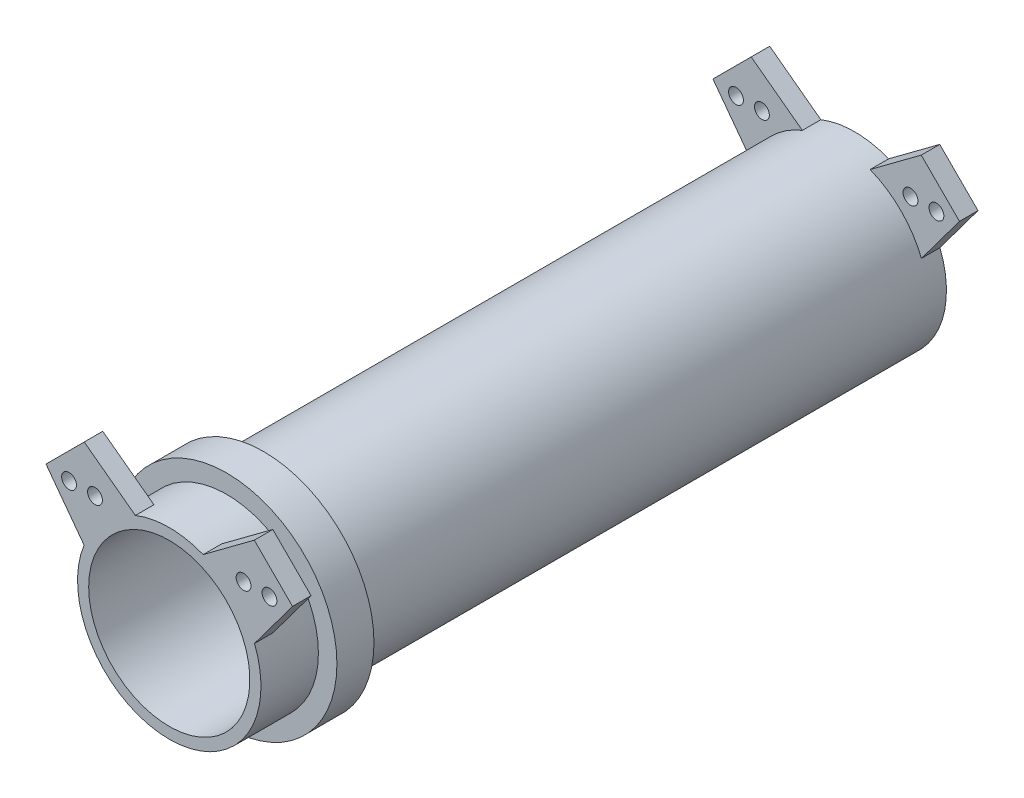
ISO-10303-21;
HEADER;
FILE_DESCRIPTION(('STEP AP214'),'2;1');
FILE_NAME('part.step','',(''),(''),'','','');
FILE_SCHEMA(('AUTOMOTIVE_DESIGN { 1 0 10303 214 1 1 1 1 }'));
ENDSEC;
DATA;
#1=APPLICATION_CONTEXT('core data for automotive mechanical design processes');
#2=APPLICATION_PROTOCOL_DEFINITION('international standard','automotive_design',2000,#1);
#3=PRODUCT_CONTEXT('',#1,'mechanical');
#4=PRODUCT('Part','Part','',(#3));
#5=PRODUCT_RELATED_PRODUCT_CATEGORY('part','',(#4));
#6=PRODUCT_DEFINITION_FORMATION('','',#4);
#7=PRODUCT_DEFINITION_CONTEXT('part definition',#1,'design');
#8=PRODUCT_DEFINITION('design','',#6,#7);
#9=PRODUCT_DEFINITION_SHAPE('','',#8);
#10=(LENGTH_UNIT() NAMED_UNIT(*) SI_UNIT(.MILLI.,.METRE.));
#11=(NAMED_UNIT(*) PLANE_ANGLE_UNIT() SI_UNIT($,.RADIAN.));
#12=(NAMED_UNIT(*) SI_UNIT($,.STERADIAN.) SOLID_ANGLE_UNIT());
#13=UNCERTAINTY_MEASURE_WITH_UNIT(LENGTH_MEASURE(1.E-05),#10,'distance_accuracy_value','');
#14=(GEOMETRIC_REPRESENTATION_CONTEXT(3) GLOBAL_UNCERTAINTY_ASSIGNED_CONTEXT((#13)) GLOBAL_UNIT_ASSIGNED_CONTEXT((#10,
#11,#12)) REPRESENTATION_CONTEXT('',''));
#15=CARTESIAN_POINT('',(0.,0.,0.));
#16=DIRECTION('',(0.,0.,1.));
#17=DIRECTION('',(1.,0.,0.));
#18=AXIS2_PLACEMENT_3D('',#15,#16,#17);
#19=CARTESIAN_POINT('',(0.,0.,90.));
#20=DIRECTION('',(0.,0.,-1.));
#21=DIRECTION('',(-1.,0.,0.));
#22=AXIS2_PLACEMENT_3D('',#19,#20,#21);
#23=CYLINDRICAL_SURFACE('',#22,24.75);
#24=CARTESIAN_POINT('',(0.,0.,67.));
#25=DIRECTION('',(0.,0.,-1.));
#26=DIRECTION('',(-1.,0.,0.));
#27=AXIS2_PLACEMENT_3D('',#24,#25,#26);
#28=CIRCLE('',#27,24.75);
#29=CARTESIAN_POINT('',(-24.75,0.,67.));
#30=VERTEX_POINT('',#29);
#31=EDGE_CURVE('E252',#30,#30,#28,.T.);
#32=ORIENTED_EDGE('',*,*,#31,.T.);
#33=EDGE_LOOP('',(#32));
#34=FACE_BOUND('',#33,.T.);
#35=DIRECTION('',(0.,0.,-1.));
#36=VECTOR('',#35,1.);
#37=CARTESIAN_POINT('',(9.14712231360463,22.9976662594263,-87.5));
#38=LINE('',#37,#36);
#39=CARTESIAN_POINT('',(9.14712231360462,22.9976662594263,-87.5));
#40=VERTEX_POINT('',#39);
#41=CARTESIAN_POINT('',(9.14712231360463,22.9976662594263,-92.5));
#42=VERTEX_POINT('',#41);
#43=EDGE_CURVE('E177',#40,#42,#38,.T.);
#44=ORIENTED_EDGE('',*,*,#43,.T.);
#45=CARTESIAN_POINT('',(0.,0.,-92.5));
#46=DIRECTION('',(0.,0.,1.));
#47=DIRECTION('',(1.,0.,0.));
#48=AXIS2_PLACEMENT_3D('',#45,#46,#47);
#49=CIRCLE('',#48,24.75);
#50=CARTESIAN_POINT('',(-9.14712231360463,22.9976662594263,-92.5));
#51=VERTEX_POINT('',#50);
#52=EDGE_CURVE('E246',#42,#51,#49,.T.);
#53=ORIENTED_EDGE('',*,*,#52,.T.);
#54=DIRECTION('',(0.,0.,-1.));
#55=VECTOR('',#54,1.);
#56=CARTESIAN_POINT('',(-9.14712231360463,22.9976662594263,-87.5));
#57=LINE('',#56,#55);
#58=CARTESIAN_POINT('',(-9.14712231360462,22.9976662594263,-87.5));
#59=VERTEX_POINT('',#58);
#60=EDGE_CURVE('E220',#59,#51,#57,.T.);
#61=ORIENTED_EDGE('',*,*,#60,.F.);
#62=CARTESIAN_POINT('',(0.,0.,-87.5));
#63=DIRECTION('',(0.,0.,1.));
#64=DIRECTION('',(1.,0.,0.));
#65=AXIS2_PLACEMENT_3D('',#62,#63,#64);
#66=CIRCLE('',#65,24.75);
#67=CARTESIAN_POINT('',(-22.9976662594264,9.14712231360437,-87.5));
#68=VERTEX_POINT('',#67);
#69=EDGE_CURVE('E212',#59,#68,#66,.T.);
#70=ORIENTED_EDGE('',*,*,#69,.T.);
#71=DIRECTION('',(0.,0.,-1.));
#72=VECTOR('',#71,1.);
#73=CARTESIAN_POINT('',(-22.9976662594264,9.14712231360438,-87.5));
#74=LINE('',#73,#72);
#75=CARTESIAN_POINT('',(-22.9976662594264,9.14712231360438,-92.5));
#76=VERTEX_POINT('',#75);
#77=EDGE_CURVE('E239',#68,#76,#74,.T.);
#78=ORIENTED_EDGE('',*,*,#77,.T.);
#79=CARTESIAN_POINT('',(22.9976662594264,9.14712231360438,-92.5));
#80=VERTEX_POINT('',#79);
#81=EDGE_CURVE('E247',#76,#80,#49,.T.);
#82=ORIENTED_EDGE('',*,*,#81,.T.);
#83=DIRECTION('',(0.,0.,-1.));
#84=VECTOR('',#83,1.);
#85=CARTESIAN_POINT('',(22.9976662594264,9.14712231360438,-87.5));
#86=LINE('',#85,#84);
#87=CARTESIAN_POINT('',(22.9976662594264,9.14712231360438,-87.5));
#88=VERTEX_POINT('',#87);
#89=EDGE_CURVE('E58',#88,#80,#86,.T.);
#90=ORIENTED_EDGE('',*,*,#89,.F.);
#91=CARTESIAN_POINT('',(0.,0.,-87.5));
#92=DIRECTION('',(0.,0.,-1.));
#93=DIRECTION('',(-1.,0.,0.));
#94=AXIS2_PLACEMENT_3D('',#91,#92,#93);
#95=CIRCLE('',#94,24.75);
#96=EDGE_CURVE('E62',#40,#88,#95,.T.);
#97=ORIENTED_EDGE('',*,*,#96,.F.);
#98=EDGE_LOOP('',(#44,#53,#61,#70,#78,#82,#90,#97));
#99=FACE_BOUND('',#98,.T.);
#100=ADVANCED_FACE('F43',(#34,#99),#23,.T.);
#101=CARTESIAN_POINT('',(0.,0.,92.5));
#102=DIRECTION('',(0.,0.,1.));
#103=DIRECTION('',(1.,0.,0.));
#104=AXIS2_PLACEMENT_3D('',#101,#102,#103);
#105=CIRCLE('',#104,24.75);
#106=CARTESIAN_POINT('',(9.14712231360463,22.9976662594263,92.5));
#107=VERTEX_POINT('',#106);
#108=CARTESIAN_POINT('',(-9.14712231360463,22.9976662594263,92.5));
#109=VERTEX_POINT('',#108);
#110=EDGE_CURVE('E339',#107,#109,#105,.T.);
#111=ORIENTED_EDGE('',*,*,#110,.F.);
#112=DIRECTION('',(0.,0.,1.));
#113=VECTOR('',#112,1.);
#114=CARTESIAN_POINT('',(9.14712231360463,22.9976662594263,87.5));
#115=LINE('',#114,#113);
#116=CARTESIAN_POINT('',(9.14712231360463,22.9976662594263,87.5));
#117=VERTEX_POINT('',#116);
#118=EDGE_CURVE('E275',#117,#107,#115,.T.);
#119=ORIENTED_EDGE('',*,*,#118,.F.);
#120=CARTESIAN_POINT('',(0.,0.,87.5));
#121=DIRECTION('',(0.,0.,-1.));
#122=DIRECTION('',(-1.,0.,0.));
#123=AXIS2_PLACEMENT_3D('',#120,#121,#122);
#124=CIRCLE('',#123,24.75);
#125=CARTESIAN_POINT('',(22.9976662594264,9.14712231360438,87.5));
#126=VERTEX_POINT('',#125);
#127=EDGE_CURVE('E266',#117,#126,#124,.T.);
#128=ORIENTED_EDGE('',*,*,#127,.T.);
#129=DIRECTION('',(0.,0.,1.));
#130=VECTOR('',#129,1.);
#131=CARTESIAN_POINT('',(22.9976662594264,9.14712231360438,87.5));
#132=LINE('',#131,#130);
#133=CARTESIAN_POINT('',(22.9976662594264,9.14712231360438,92.5));
#134=VERTEX_POINT('',#133);
#135=EDGE_CURVE('E293',#126,#134,#132,.T.);
#136=ORIENTED_EDGE('',*,*,#135,.T.);
#137=CARTESIAN_POINT('',(-22.9976662594264,9.14712231360438,92.5));
#138=VERTEX_POINT('',#137);
#139=EDGE_CURVE('E340',#138,#134,#105,.T.);
#140=ORIENTED_EDGE('',*,*,#139,.F.);
#141=DIRECTION('',(0.,0.,1.));
#142=VECTOR('',#141,1.);
#143=CARTESIAN_POINT('',(-22.9976662594264,9.14712231360438,87.5));
#144=LINE('',#143,#142);
#145=CARTESIAN_POINT('',(-22.9976662594264,9.14712231360438,87.5));
#146=VERTEX_POINT('',#145);
#147=EDGE_CURVE('E329',#146,#138,#144,.T.);
#148=ORIENTED_EDGE('',*,*,#147,.F.);
#149=CARTESIAN_POINT('',(0.,0.,87.5));
#150=DIRECTION('',(0.,0.,1.));
#151=DIRECTION('',(1.,0.,0.));
#152=AXIS2_PLACEMENT_3D('',#149,#150,#151);
#153=CIRCLE('',#152,24.75);
#154=CARTESIAN_POINT('',(-9.14712231360463,22.9976662594263,87.5));
#155=VERTEX_POINT('',#154);
#156=EDGE_CURVE('E311',#155,#146,#153,.T.);
#157=ORIENTED_EDGE('',*,*,#156,.F.);
#158=DIRECTION('',(0.,0.,1.));
#159=VECTOR('',#158,1.);
#160=CARTESIAN_POINT('',(-9.14712231360463,22.9976662594263,87.5));
#161=LINE('',#160,#159);
#162=EDGE_CURVE('E325',#155,#109,#161,.T.);
#163=ORIENTED_EDGE('',*,*,#162,.T.);
#164=EDGE_LOOP('',(#111,#119,#128,#136,#140,#148,#157,#163));
#165=FACE_BOUND('',#164,.T.);
#166=CARTESIAN_POINT('',(0.,0.,77.));
#167=DIRECTION('',(0.,0.,1.));
#168=DIRECTION('',(1.,0.,0.));
#169=AXIS2_PLACEMENT_3D('',#166,#167,#168);
#170=CIRCLE('',#169,24.75);
#171=CARTESIAN_POINT('',(24.75,0.,77.));
#172=VERTEX_POINT('',#171);
#173=EDGE_CURVE('E11',#172,#172,#170,.T.);
#174=ORIENTED_EDGE('',*,*,#173,.T.);
#175=EDGE_LOOP('',(#174));
#176=FACE_BOUND('',#175,.T.);
#177=ADVANCED_FACE('F45',(#165,#176),#23,.T.);
#178=CARTESIAN_POINT('',(0.,0.,90.));
#179=DIRECTION('',(0.,0.,-1.));
#180=DIRECTION('',(-1.,0.,0.));
#181=AXIS2_PLACEMENT_3D('',#178,#179,#180);
#182=CYLINDRICAL_SURFACE('',#181,21.75);
#183=CARTESIAN_POINT('',(0.,0.,-92.5));
#184=DIRECTION('',(0.,0.,1.));
#185=DIRECTION('',(1.,0.,0.));
#186=AXIS2_PLACEMENT_3D('',#183,#184,#185);
#187=CIRCLE('',#186,21.75);
#188=CARTESIAN_POINT('',(-21.75,0.,-92.5));
#189=VERTEX_POINT('',#188);
#190=EDGE_CURVE('E236',#189,#189,#187,.T.);
#191=CARTESIAN_POINT('',(0.,0.,92.5));
#192=DIRECTION('',(0.,0.,1.));
#193=DIRECTION('',(1.,0.,0.));
#194=AXIS2_PLACEMENT_3D('',#191,#192,#193);
#195=CIRCLE('',#194,21.75);
#196=CARTESIAN_POINT('',(-21.75,0.,92.5));
#197=VERTEX_POINT('',#196);
#198=EDGE_CURVE('E328',#197,#197,#195,.T.);
#199=CARTESIAN_POINT('',(-21.75,0.,-92.5));
#200=CARTESIAN_POINT('',(-21.75,0.,-90.5729166666667));
#201=CARTESIAN_POINT('',(-21.75,0.,-88.6458333333334));
#202=CARTESIAN_POINT('',(-21.75,0.,-84.7916666666667));
#203=CARTESIAN_POINT('',(-21.75,0.,-82.8645833333334));
#204=CARTESIAN_POINT('',(-21.75,0.,-79.0104166666667));
#205=CARTESIAN_POINT('',(-21.75,0.,-77.0833333333334));
#206=CARTESIAN_POINT('',(-21.75,0.,-73.2291666666667));
#207=CARTESIAN_POINT('',(-21.75,0.,-71.3020833333334));
#208=CARTESIAN_POINT('',(-21.75,0.,-67.4479166666667));
#209=CARTESIAN_POINT('',(-21.75,0.,-65.5208333333333));
#210=CARTESIAN_POINT('',(-21.75,0.,-61.6666666666667));
#211=CARTESIAN_POINT('',(-21.75,0.,-59.7395833333333));
#212=CARTESIAN_POINT('',(-21.75,0.,-55.8854166666667));
#213=CARTESIAN_POINT('',(-21.75,0.,-53.9583333333334));
#214=CARTESIAN_POINT('',(-21.75,0.,-50.1041666666667));
#215=CARTESIAN_POINT('',(-21.75,0.,-48.1770833333333));
#216=CARTESIAN_POINT('',(-21.75,0.,-44.3229166666667));
#217=CARTESIAN_POINT('',(-21.75,0.,-42.3958333333333));
#218=CARTESIAN_POINT('',(-21.75,0.,-38.5416666666667));
#219=CARTESIAN_POINT('',(-21.75,0.,-36.6145833333333));
#220=CARTESIAN_POINT('',(-21.75,0.,-32.7604166666667));
#221=CARTESIAN_POINT('',(-21.75,0.,-30.8333333333334));
#222=CARTESIAN_POINT('',(-21.75,0.,-26.9791666666667));
#223=CARTESIAN_POINT('',(-21.75,0.,-25.0520833333334));
#224=CARTESIAN_POINT('',(-21.75,0.,-21.1979166666667));
#225=CARTESIAN_POINT('',(-21.75,0.,-19.2708333333333));
#226=CARTESIAN_POINT('',(-21.75,0.,-15.4166666666667));
#227=CARTESIAN_POINT('',(-21.75,0.,-13.4895833333334));
#228=CARTESIAN_POINT('',(-21.75,0.,-9.63541666666668));
#229=CARTESIAN_POINT('',(-21.75,0.,-7.70833333333335));
#230=CARTESIAN_POINT('',(-21.75,0.,-3.85416666666668));
#231=CARTESIAN_POINT('',(-21.75,0.,-1.92708333333335));
#232=CARTESIAN_POINT('',(-21.75,0.,1.92708333333332));
#233=CARTESIAN_POINT('',(-21.75,0.,3.85416666666665));
#234=CARTESIAN_POINT('',(-21.75,0.,7.70833333333332));
#235=CARTESIAN_POINT('',(-21.75,0.,9.63541666666666));
#236=CARTESIAN_POINT('',(-21.75,0.,13.4895833333333));
#237=CARTESIAN_POINT('',(-21.75,0.,15.4166666666667));
#238=CARTESIAN_POINT('',(-21.75,0.,19.2708333333333));
#239=CARTESIAN_POINT('',(-21.75,0.,21.1979166666667));
#240=CARTESIAN_POINT('',(-21.75,0.,25.0520833333333));
#241=CARTESIAN_POINT('',(-21.75,0.,26.9791666666667));
#242=CARTESIAN_POINT('',(-21.75,0.,30.8333333333333));
#243=CARTESIAN_POINT('',(-21.75,0.,32.7604166666667));
#244=CARTESIAN_POINT('',(-21.75,0.,36.6145833333333));
#245=CARTESIAN_POINT('',(-21.75,0.,38.5416666666667));
#246=CARTESIAN_POINT('',(-21.75,0.,42.3958333333333));
#247=CARTESIAN_POINT('',(-21.75,0.,44.3229166666667));
#248=CARTESIAN_POINT('',(-21.75,0.,48.1770833333333));
#249=CARTESIAN_POINT('',(-21.75,0.,50.1041666666667));
#250=CARTESIAN_POINT('',(-21.75,0.,53.9583333333333));
#251=CARTESIAN_POINT('',(-21.75,0.,55.8854166666667));
#252=CARTESIAN_POINT('',(-21.75,0.,59.7395833333333));
#253=CARTESIAN_POINT('',(-21.75,0.,61.6666666666667));
#254=CARTESIAN_POINT('',(-21.75,0.,65.5208333333333));
#255=CARTESIAN_POINT('',(-21.75,0.,67.4479166666666));
#256=CARTESIAN_POINT('',(-21.75,0.,71.3020833333333));
#257=CARTESIAN_POINT('',(-21.75,0.,73.2291666666667));
#258=CARTESIAN_POINT('',(-21.75,0.,77.0833333333333));
#259=CARTESIAN_POINT('',(-21.75,0.,79.0104166666667));
#260=CARTESIAN_POINT('',(-21.75,0.,82.8645833333333));
#261=CARTESIAN_POINT('',(-21.75,0.,84.7916666666667));
#262=CARTESIAN_POINT('',(-21.75,0.,88.6458333333333));
#263=CARTESIAN_POINT('',(-21.75,0.,90.5729166666667));
#264=CARTESIAN_POINT('',(-21.75,0.,92.5));
#265=B_SPLINE_CURVE_WITH_KNOTS('',3,(#199,#200,#201,#202,#203,#204,#205,#206,#207,#208,#209,
#210,#211,#212,#213,#214,#215,#216,#217,#218,#219,#220,#221,#222,#223,#224,#225,#226,#227,#228,
#229,#230,#231,#232,#233,#234,#235,#236,#237,#238,#239,#240,#241,#242,#243,#244,#245,#246,#247,
#248,#249,#250,#251,#252,#253,#254,#255,#256,#257,#258,#259,#260,#261,#262,#263,#264),
.UNSPECIFIED.,.F.,.F.,(4,2,2,2,2,2,2,2,2,2,2,2,2,2,2,2,2,2,2,2,2,2,2,2,2,2,2,2,2,2,2,2,4),(0.,
5.78125000000002,11.5625,17.34375,23.125,28.90625,34.6875,40.46875,46.25,52.03125,57.8125,
63.59375,69.375,75.15625,80.9375,86.71875,92.5,98.28125,104.0625,109.84375,115.625,121.40625,
127.1875,132.96875,138.75,144.53125,150.3125,156.09375,161.875,167.65625,173.4375,179.21875,
185.),.UNSPECIFIED.);
#266=EDGE_CURVE('BSEAM474',#189,#197,#265,.T.);
#267=ORIENTED_EDGE('',*,*,#190,.F.);
#268=ORIENTED_EDGE('',*,*,#198,.T.);
#269=ORIENTED_EDGE('',*,*,#266,.T.);
#270=ORIENTED_EDGE('',*,*,#266,.F.);
#271=EDGE_LOOP('',(#267,#269,#268,#270));
#272=FACE_BOUND('',#271,.T.);
#273=ADVANCED_FACE('F474',(#272),#182,.F.);
#274=CARTESIAN_POINT('',(0.,0.,77.));
#275=DIRECTION('',(0.,0.,1.));
#276=DIRECTION('',(1.,0.,0.));
#277=AXIS2_PLACEMENT_3D('',#274,#275,#276);
#278=PLANE('',#277);
#279=CARTESIAN_POINT('',(0.,0.,77.));
#280=DIRECTION('',(0.,0.,1.));
#281=DIRECTION('',(1.,0.,0.));
#282=AXIS2_PLACEMENT_3D('',#279,#280,#281);
#283=CIRCLE('',#282,29.75);
#284=CARTESIAN_POINT('',(29.75,0.,77.));
#285=VERTEX_POINT('',#284);
#286=EDGE_CURVE('E51',#285,#285,#283,.T.);
#287=ORIENTED_EDGE('',*,*,#286,.T.);
#288=EDGE_LOOP('',(#287));
#289=FACE_BOUND('',#288,.T.);
#290=ORIENTED_EDGE('',*,*,#173,.F.);
#291=EDGE_LOOP('',(#290));
#292=FACE_BOUND('',#291,.T.);
#293=ADVANCED_FACE('F345',(#289,#292),#278,.T.);
#294=CARTESIAN_POINT('',(0.,0.,77.));
#295=DIRECTION('',(0.,0.,-1.));
#296=DIRECTION('',(-1.,0.,0.));
#297=AXIS2_PLACEMENT_3D('',#294,#295,#296);
#298=CYLINDRICAL_SURFACE('',#297,29.75);
#299=ORIENTED_EDGE('',*,*,#286,.F.);
#300=EDGE_LOOP('',(#299));
#301=FACE_BOUND('',#300,.T.);
#302=CARTESIAN_POINT('',(0.,0.,67.));
#303=DIRECTION('',(0.,0.,1.));
#304=DIRECTION('',(1.,0.,0.));
#305=AXIS2_PLACEMENT_3D('',#302,#303,#304);
#306=CIRCLE('',#305,29.75);
#307=CARTESIAN_POINT('',(29.75,0.,67.));
#308=VERTEX_POINT('',#307);
#309=EDGE_CURVE('E249',#308,#308,#306,.T.);
#310=ORIENTED_EDGE('',*,*,#309,.T.);
#311=EDGE_LOOP('',(#310));
#312=FACE_BOUND('',#311,.T.);
#313=ADVANCED_FACE('F348',(#301,#312),#298,.T.);
#314=CARTESIAN_POINT('',(0.,0.,92.5));
#315=DIRECTION('',(0.,0.,1.));
#316=DIRECTION('',(1.,0.,0.));
#317=AXIS2_PLACEMENT_3D('',#314,#315,#316);
#318=PLANE('',#317);
#319=ORIENTED_EDGE('',*,*,#139,.T.);
#320=DIRECTION('',(0.596996927943198,0.802243521648124,0.));
#321=VECTOR('',#320,1.);
#322=CARTESIAN_POINT('',(10.4202808132108,-7.75434823208315,92.5));
#323=LINE('',#322,#321);
#324=CARTESIAN_POINT('',(33.2674063718993,22.9475827324311,92.5));
#325=VERTEX_POINT('',#324);
#326=EDGE_CURVE('E283',#134,#325,#323,.T.);
#327=ORIENTED_EDGE('',*,*,#326,.T.);
#328=DIRECTION('',(-0.707106781186544,0.707106781186552,0.));
#329=VECTOR('',#328,1.);
#330=CARTESIAN_POINT('',(28.1074945521654,28.1074945521651,92.5));
#331=LINE('',#330,#329);
#332=CARTESIAN_POINT('',(22.9475827324315,33.2674063718991,92.5));
#333=VERTEX_POINT('',#332);
#334=EDGE_CURVE('E260',#325,#333,#331,.T.);
#335=ORIENTED_EDGE('',*,*,#334,.T.);
#336=DIRECTION('',(-0.802243521648131,-0.596996927943189,0.));
#337=VECTOR('',#336,1.);
#338=CARTESIAN_POINT('',(-7.75434823208304,10.4202808132109,92.5));
#339=LINE('',#338,#337);
#340=EDGE_CURVE('E281',#333,#107,#339,.T.);
#341=ORIENTED_EDGE('',*,*,#340,.T.);
#342=ORIENTED_EDGE('',*,*,#110,.T.);
#343=DIRECTION('',(0.802243521648131,-0.596996927943189,0.));
#344=VECTOR('',#343,1.);
#345=CARTESIAN_POINT('',(7.75434823208304,10.4202808132109,92.5));
#346=LINE('',#345,#344);
#347=CARTESIAN_POINT('',(-22.9475827324315,33.2674063718991,92.5));
#348=VERTEX_POINT('',#347);
#349=EDGE_CURVE('E319',#348,#109,#346,.T.);
#350=ORIENTED_EDGE('',*,*,#349,.F.);
#351=DIRECTION('',(0.707106781186544,0.707106781186552,0.));
#352=VECTOR('',#351,1.);
#353=CARTESIAN_POINT('',(-28.1074945521654,28.1074945521651,92.5));
#354=LINE('',#353,#352);
#355=CARTESIAN_POINT('',(-33.2674063718993,22.9475827324311,92.5));
#356=VERTEX_POINT('',#355);
#357=EDGE_CURVE('E322',#356,#348,#354,.T.);
#358=ORIENTED_EDGE('',*,*,#357,.F.);
#359=DIRECTION('',(-0.596996927943198,0.802243521648124,0.));
#360=VECTOR('',#359,1.);
#361=CARTESIAN_POINT('',(-10.4202808132108,-7.75434823208315,92.5));
#362=LINE('',#361,#360);
#363=EDGE_CURVE('E302',#138,#356,#362,.T.);
#364=ORIENTED_EDGE('',*,*,#363,.F.);
#365=EDGE_LOOP('',(#319,#327,#335,#341,#342,#350,#358,#364));
#366=FACE_BOUND('',#365,.T.);
#367=ORIENTED_EDGE('',*,*,#198,.F.);
#368=EDGE_LOOP('',(#367));
#369=FACE_BOUND('',#368,.T.);
#370=CARTESIAN_POINT('',(-27.0468343803856,22.0970869120794,92.5));
#371=DIRECTION('',(0.,0.,1.));
#372=DIRECTION('',(1.,0.,0.));
#373=AXIS2_PLACEMENT_3D('',#370,#371,#372);
#374=CIRCLE('',#373,2.0000000000001);
#375=CARTESIAN_POINT('',(-25.0468343803855,22.0970869120794,92.5));
#376=VERTEX_POINT('',#375);
#377=EDGE_CURVE('E290',#376,#376,#374,.T.);
#378=ORIENTED_EDGE('',*,*,#377,.F.);
#379=EDGE_LOOP('',(#378));
#380=FACE_BOUND('',#379,.T.);
#381=CARTESIAN_POINT('',(-20.0468343803856,22.0970869120794,92.5));
#382=DIRECTION('',(0.,0.,1.));
#383=DIRECTION('',(1.,0.,0.));
#384=AXIS2_PLACEMENT_3D('',#381,#382,#383);
#385=CIRCLE('',#384,2.00000000000001);
#386=CARTESIAN_POINT('',(-18.0468343803856,22.0970869120794,92.5));
#387=VERTEX_POINT('',#386);
#388=EDGE_CURVE('E316',#387,#387,#385,.T.);
#389=ORIENTED_EDGE('',*,*,#388,.F.);
#390=EDGE_LOOP('',(#389));
#391=FACE_BOUND('',#390,.T.);
#392=CARTESIAN_POINT('',(27.0468343803856,22.0970869120794,92.5));
#393=DIRECTION('',(0.,0.,-1.));
#394=DIRECTION('',(-1.,0.,0.));
#395=AXIS2_PLACEMENT_3D('',#392,#393,#394);
#396=CIRCLE('',#395,2.0000000000001);
#397=CARTESIAN_POINT('',(25.0468343803855,22.0970869120794,92.5));
#398=VERTEX_POINT('',#397);
#399=EDGE_CURVE('E255',#398,#398,#396,.T.);
#400=ORIENTED_EDGE('',*,*,#399,.T.);
#401=EDGE_LOOP('',(#400));
#402=FACE_BOUND('',#401,.T.);
#403=CARTESIAN_POINT('',(20.0468343803856,22.0970869120794,92.5));
#404=DIRECTION('',(0.,0.,-1.));
#405=DIRECTION('',(-1.,0.,0.));
#406=AXIS2_PLACEMENT_3D('',#403,#404,#405);
#407=CIRCLE('',#406,2.00000000000001);
#408=CARTESIAN_POINT('',(18.0468343803856,22.0970869120794,92.5));
#409=VERTEX_POINT('',#408);
#410=EDGE_CURVE('E278',#409,#409,#407,.T.);
#411=ORIENTED_EDGE('',*,*,#410,.T.);
#412=EDGE_LOOP('',(#411));
#413=FACE_BOUND('',#412,.T.);
#414=ADVANCED_FACE('F351',(#366,#369,#380,#391,#402,#413),#318,.T.);
#415=CARTESIAN_POINT('',(7.75434823208304,10.4202808132109,87.5));
#416=DIRECTION('',(-0.596996927943189,-0.802243521648131,0.));
#417=DIRECTION('',(0.802243521648131,-0.596996927943189,0.));
#418=AXIS2_PLACEMENT_3D('',#415,#416,#417);
#419=PLANE('',#418);
#420=ORIENTED_EDGE('',*,*,#349,.T.);
#421=ORIENTED_EDGE('',*,*,#162,.F.);
#422=DIRECTION('',(0.802243521648131,-0.596996927943189,0.));
#423=VECTOR('',#422,1.);
#424=CARTESIAN_POINT('',(7.75434823208304,10.4202808132109,87.5));
#425=LINE('',#424,#423);
#426=CARTESIAN_POINT('',(-22.9475827324315,33.2674063718991,87.5));
#427=VERTEX_POINT('',#426);
#428=EDGE_CURVE('E305',#427,#155,#425,.T.);
#429=ORIENTED_EDGE('',*,*,#428,.F.);
#430=DIRECTION('',(0.,0.,1.));
#431=VECTOR('',#430,1.);
#432=CARTESIAN_POINT('',(-22.9475827324315,33.2674063718991,87.5));
#433=LINE('',#432,#431);
#434=EDGE_CURVE('E313',#427,#348,#433,.T.);
#435=ORIENTED_EDGE('',*,*,#434,.T.);
#436=EDGE_LOOP('',(#420,#421,#429,#435));
#437=FACE_BOUND('',#436,.T.);
#438=ADVANCED_FACE('F455',(#437),#419,.F.);
#439=CARTESIAN_POINT('',(-10.4202808132108,-7.75434823208315,87.5));
#440=DIRECTION('',(0.802243521648124,0.596996927943198,0.));
#441=DIRECTION('',(-0.596996927943198,0.802243521648124,0.));
#442=AXIS2_PLACEMENT_3D('',#439,#440,#441);
#443=PLANE('',#442);
#444=ORIENTED_EDGE('',*,*,#363,.T.);
#445=DIRECTION('',(0.,0.,1.));
#446=VECTOR('',#445,1.);
#447=CARTESIAN_POINT('',(-33.2674063718993,22.9475827324311,87.5));
#448=LINE('',#447,#446);
#449=CARTESIAN_POINT('',(-33.2674063718993,22.9475827324311,87.5));
#450=VERTEX_POINT('',#449);
#451=EDGE_CURVE('E332',#450,#356,#448,.T.);
#452=ORIENTED_EDGE('',*,*,#451,.F.);
#453=DIRECTION('',(-0.596996927943198,0.802243521648124,0.));
#454=VECTOR('',#453,1.);
#455=CARTESIAN_POINT('',(-10.4202808132108,-7.75434823208315,87.5));
#456=LINE('',#455,#454);
#457=EDGE_CURVE('E309',#146,#450,#456,.T.);
#458=ORIENTED_EDGE('',*,*,#457,.F.);
#459=ORIENTED_EDGE('',*,*,#147,.T.);
#460=EDGE_LOOP('',(#444,#452,#458,#459));
#461=FACE_BOUND('',#460,.T.);
#462=ADVANCED_FACE('F451',(#461),#443,.F.);
#463=CARTESIAN_POINT('',(-20.0468343803856,22.0970869120794,87.5));
#464=DIRECTION('',(0.,0.,1.));
#465=DIRECTION('',(1.,0.,0.));
#466=AXIS2_PLACEMENT_3D('',#463,#464,#465);
#467=CYLINDRICAL_SURFACE('',#466,2.00000000000001);
#468=CARTESIAN_POINT('',(-20.0468343803856,22.0970869120794,87.5));
#469=DIRECTION('',(0.,0.,1.));
#470=DIRECTION('',(1.,0.,0.));
#471=AXIS2_PLACEMENT_3D('',#468,#469,#470);
#472=CIRCLE('',#471,2.00000000000001);
#473=CARTESIAN_POINT('',(-18.0468343803856,22.0970869120794,87.5));
#474=VERTEX_POINT('',#473);
#475=EDGE_CURVE('E301',#474,#474,#472,.T.);
#476=ORIENTED_EDGE('',*,*,#475,.F.);
#477=EDGE_LOOP('',(#476));
#478=FACE_BOUND('',#477,.T.);
#479=ORIENTED_EDGE('',*,*,#388,.T.);
#480=EDGE_LOOP('',(#479));
#481=FACE_BOUND('',#480,.T.);
#482=ADVANCED_FACE('F454',(#478,#481),#467,.F.);
#483=CARTESIAN_POINT('',(-27.0468343803856,22.0970869120794,87.5));
#484=DIRECTION('',(0.,0.,1.));
#485=DIRECTION('',(1.,0.,0.));
#486=AXIS2_PLACEMENT_3D('',#483,#484,#485);
#487=CYLINDRICAL_SURFACE('',#486,2.0000000000001);
#488=CARTESIAN_POINT('',(-27.0468343803856,22.0970869120794,87.5));
#489=DIRECTION('',(0.,0.,1.));
#490=DIRECTION('',(1.,0.,0.));
#491=AXIS2_PLACEMENT_3D('',#488,#489,#490);
#492=CIRCLE('',#491,2.0000000000001);
#493=CARTESIAN_POINT('',(-25.0468343803855,22.0970869120794,87.5));
#494=VERTEX_POINT('',#493);
#495=EDGE_CURVE('E298',#494,#494,#492,.T.);
#496=ORIENTED_EDGE('',*,*,#495,.F.);
#497=EDGE_LOOP('',(#496));
#498=FACE_BOUND('',#497,.T.);
#499=ORIENTED_EDGE('',*,*,#377,.T.);
#500=EDGE_LOOP('',(#499));
#501=FACE_BOUND('',#500,.T.);
#502=ADVANCED_FACE('F459',(#498,#501),#487,.F.);
#503=CARTESIAN_POINT('',(-28.1074945521654,28.1074945521651,87.5));
#504=DIRECTION('',(0.707106781186552,-0.707106781186544,0.));
#505=DIRECTION('',(0.707106781186544,0.707106781186551,0.));
#506=AXIS2_PLACEMENT_3D('',#503,#504,#505);
#507=PLANE('',#506);
#508=ORIENTED_EDGE('',*,*,#357,.T.);
#509=ORIENTED_EDGE('',*,*,#434,.F.);
#510=DIRECTION('',(0.707106781186544,0.707106781186552,0.));
#511=VECTOR('',#510,1.);
#512=CARTESIAN_POINT('',(-28.1074945521654,28.1074945521651,87.5));
#513=LINE('',#512,#511);
#514=EDGE_CURVE('E307',#450,#427,#513,.T.);
#515=ORIENTED_EDGE('',*,*,#514,.F.);
#516=ORIENTED_EDGE('',*,*,#451,.T.);
#517=EDGE_LOOP('',(#508,#509,#515,#516));
#518=FACE_BOUND('',#517,.T.);
#519=ADVANCED_FACE('F449',(#518),#507,.F.);
#520=CARTESIAN_POINT('',(0.,0.,87.5));
#521=DIRECTION('',(0.,0.,1.));
#522=DIRECTION('',(1.,0.,0.));
#523=AXIS2_PLACEMENT_3D('',#520,#521,#522);
#524=PLANE('',#523);
#525=ORIENTED_EDGE('',*,*,#495,.T.);
#526=EDGE_LOOP('',(#525));
#527=FACE_BOUND('',#526,.T.);
#528=ORIENTED_EDGE('',*,*,#475,.T.);
#529=EDGE_LOOP('',(#528));
#530=FACE_BOUND('',#529,.T.);
#531=ORIENTED_EDGE('',*,*,#428,.T.);
#532=ORIENTED_EDGE('',*,*,#156,.T.);
#533=ORIENTED_EDGE('',*,*,#457,.T.);
#534=ORIENTED_EDGE('',*,*,#514,.T.);
#535=EDGE_LOOP('',(#531,#532,#533,#534));
#536=FACE_BOUND('',#535,.T.);
#537=ADVANCED_FACE('F439',(#527,#530,#536),#524,.F.);
#538=CARTESIAN_POINT('',(-7.75434823208304,10.4202808132109,87.5));
#539=DIRECTION('',(-0.596996927943189,0.802243521648131,0.));
#540=DIRECTION('',(-0.802243521648131,-0.596996927943189,0.));
#541=AXIS2_PLACEMENT_3D('',#538,#539,#540);
#542=PLANE('',#541);
#543=ORIENTED_EDGE('',*,*,#340,.F.);
#544=DIRECTION('',(0.,0.,1.));
#545=VECTOR('',#544,1.);
#546=CARTESIAN_POINT('',(22.9475827324315,33.2674063718991,87.5));
#547=LINE('',#546,#545);
#548=CARTESIAN_POINT('',(22.9475827324315,33.2674063718991,87.5));
#549=VERTEX_POINT('',#548);
#550=EDGE_CURVE('E288',#549,#333,#547,.T.);
#551=ORIENTED_EDGE('',*,*,#550,.F.);
#552=DIRECTION('',(-0.802243521648131,-0.596996927943189,0.));
#553=VECTOR('',#552,1.);
#554=CARTESIAN_POINT('',(-7.75434823208304,10.4202808132109,87.5));
#555=LINE('',#554,#553);
#556=EDGE_CURVE('E263',#549,#117,#555,.T.);
#557=ORIENTED_EDGE('',*,*,#556,.T.);
#558=ORIENTED_EDGE('',*,*,#118,.T.);
#559=EDGE_LOOP('',(#543,#551,#557,#558));
#560=FACE_BOUND('',#559,.T.);
#561=ADVANCED_FACE('F431',(#560),#542,.T.);
#562=CARTESIAN_POINT('',(28.1074945521654,28.1074945521651,87.5));
#563=DIRECTION('',(0.707106781186552,0.707106781186544,0.));
#564=DIRECTION('',(-0.707106781186544,0.707106781186551,0.));
#565=AXIS2_PLACEMENT_3D('',#562,#563,#564);
#566=PLANE('',#565);
#567=ORIENTED_EDGE('',*,*,#334,.F.);
#568=DIRECTION('',(0.,0.,1.));
#569=VECTOR('',#568,1.);
#570=CARTESIAN_POINT('',(33.2674063718993,22.9475827324311,87.5));
#571=LINE('',#570,#569);
#572=CARTESIAN_POINT('',(33.2674063718993,22.9475827324311,87.5));
#573=VERTEX_POINT('',#572);
#574=EDGE_CURVE('E291',#573,#325,#571,.T.);
#575=ORIENTED_EDGE('',*,*,#574,.F.);
#576=DIRECTION('',(-0.707106781186544,0.707106781186552,0.));
#577=VECTOR('',#576,1.);
#578=CARTESIAN_POINT('',(28.1074945521654,28.1074945521651,87.5));
#579=LINE('',#578,#577);
#580=EDGE_CURVE('E272',#573,#549,#579,.T.);
#581=ORIENTED_EDGE('',*,*,#580,.T.);
#582=ORIENTED_EDGE('',*,*,#550,.T.);
#583=EDGE_LOOP('',(#567,#575,#581,#582));
#584=FACE_BOUND('',#583,.T.);
#585=ADVANCED_FACE('F427',(#584),#566,.T.);
#586=CARTESIAN_POINT('',(10.4202808132108,-7.75434823208315,87.5));
#587=DIRECTION('',(0.802243521648124,-0.596996927943198,0.));
#588=DIRECTION('',(0.596996927943198,0.802243521648124,0.));
#589=AXIS2_PLACEMENT_3D('',#586,#587,#588);
#590=PLANE('',#589);
#591=ORIENTED_EDGE('',*,*,#326,.F.);
#592=ORIENTED_EDGE('',*,*,#135,.F.);
#593=DIRECTION('',(0.596996927943198,0.802243521648124,0.));
#594=VECTOR('',#593,1.);
#595=CARTESIAN_POINT('',(10.4202808132108,-7.75434823208315,87.5));
#596=LINE('',#595,#594);
#597=EDGE_CURVE('E269',#126,#573,#596,.T.);
#598=ORIENTED_EDGE('',*,*,#597,.T.);
#599=ORIENTED_EDGE('',*,*,#574,.T.);
#600=EDGE_LOOP('',(#591,#592,#598,#599));
#601=FACE_BOUND('',#600,.T.);
#602=ADVANCED_FACE('F430',(#601),#590,.T.);
#603=CARTESIAN_POINT('',(20.0468343803856,22.0970869120794,87.5));
#604=DIRECTION('',(0.,0.,1.));
#605=DIRECTION('',(1.,0.,0.));
#606=AXIS2_PLACEMENT_3D('',#603,#604,#605);
#607=CYLINDRICAL_SURFACE('',#606,2.00000000000001);
#608=CARTESIAN_POINT('',(20.0468343803856,22.0970869120794,87.5));
#609=DIRECTION('',(0.,0.,-1.));
#610=DIRECTION('',(-1.,0.,0.));
#611=AXIS2_PLACEMENT_3D('',#608,#609,#610);
#612=CIRCLE('',#611,2.00000000000001);
#613=CARTESIAN_POINT('',(18.0468343803856,22.0970869120794,87.5));
#614=VERTEX_POINT('',#613);
#615=EDGE_CURVE('E259',#614,#614,#612,.T.);
#616=ORIENTED_EDGE('',*,*,#615,.T.);
#617=EDGE_LOOP('',(#616));
#618=FACE_BOUND('',#617,.T.);
#619=ORIENTED_EDGE('',*,*,#410,.F.);
#620=EDGE_LOOP('',(#619));
#621=FACE_BOUND('',#620,.T.);
#622=ADVANCED_FACE('F435',(#618,#621),#607,.F.);
#623=CARTESIAN_POINT('',(27.0468343803856,22.0970869120794,87.5));
#624=DIRECTION('',(0.,0.,1.));
#625=DIRECTION('',(1.,0.,0.));
#626=AXIS2_PLACEMENT_3D('',#623,#624,#625);
#627=CYLINDRICAL_SURFACE('',#626,2.0000000000001);
#628=CARTESIAN_POINT('',(27.0468343803856,22.0970869120794,87.5));
#629=DIRECTION('',(0.,0.,-1.));
#630=DIRECTION('',(-1.,0.,0.));
#631=AXIS2_PLACEMENT_3D('',#628,#629,#630);
#632=CIRCLE('',#631,2.0000000000001);
#633=CARTESIAN_POINT('',(25.0468343803855,22.0970869120794,87.5));
#634=VERTEX_POINT('',#633);
#635=EDGE_CURVE('E256',#634,#634,#632,.T.);
#636=ORIENTED_EDGE('',*,*,#635,.T.);
#637=EDGE_LOOP('',(#636));
#638=FACE_BOUND('',#637,.T.);
#639=ORIENTED_EDGE('',*,*,#399,.F.);
#640=EDGE_LOOP('',(#639));
#641=FACE_BOUND('',#640,.T.);
#642=ADVANCED_FACE('F425',(#638,#641),#627,.F.);
#643=CARTESIAN_POINT('',(0.,0.,87.5));
#644=DIRECTION('',(0.,0.,1.));
#645=DIRECTION('',(-1.,0.,0.));
#646=AXIS2_PLACEMENT_3D('',#643,#644,#645);
#647=PLANE('',#646);
#648=ORIENTED_EDGE('',*,*,#635,.F.);
#649=EDGE_LOOP('',(#648));
#650=FACE_BOUND('',#649,.T.);
#651=ORIENTED_EDGE('',*,*,#615,.F.);
#652=EDGE_LOOP('',(#651));
#653=FACE_BOUND('',#652,.T.);
#654=ORIENTED_EDGE('',*,*,#556,.F.);
#655=ORIENTED_EDGE('',*,*,#580,.F.);
#656=ORIENTED_EDGE('',*,*,#597,.F.);
#657=ORIENTED_EDGE('',*,*,#127,.F.);
#658=EDGE_LOOP('',(#654,#655,#656,#657));
#659=FACE_BOUND('',#658,.T.);
#660=ADVANCED_FACE('F359',(#650,#653,#659),#647,.F.);
#661=CARTESIAN_POINT('',(0.,0.,67.));
#662=DIRECTION('',(0.,0.,-1.));
#663=DIRECTION('',(1.,0.,0.));
#664=AXIS2_PLACEMENT_3D('',#661,#662,#663);
#665=PLANE('',#664);
#666=ORIENTED_EDGE('',*,*,#309,.F.);
#667=EDGE_LOOP('',(#666));
#668=FACE_BOUND('',#667,.T.);
#669=ORIENTED_EDGE('',*,*,#31,.F.);
#670=EDGE_LOOP('',(#669));
#671=FACE_BOUND('',#670,.T.);
#672=ADVANCED_FACE('F355',(#668,#671),#665,.T.);
#673=CARTESIAN_POINT('',(0.,0.,-92.5));
#674=DIRECTION('',(0.,0.,-1.));
#675=DIRECTION('',(1.,0.,0.));
#676=AXIS2_PLACEMENT_3D('',#673,#674,#675);
#677=PLANE('',#676);
#678=ORIENTED_EDGE('',*,*,#190,.T.);
#679=EDGE_LOOP('',(#678));
#680=FACE_BOUND('',#679,.T.);
#681=ORIENTED_EDGE('',*,*,#81,.F.);
#682=DIRECTION('',(-0.596996927943198,0.802243521648124,0.));
#683=VECTOR('',#682,1.);
#684=CARTESIAN_POINT('',(-10.4202808132108,-7.75434823208315,-92.5));
#685=LINE('',#684,#683);
#686=CARTESIAN_POINT('',(-33.2674063718993,22.9475827324311,-92.5));
#687=VERTEX_POINT('',#686);
#688=EDGE_CURVE('E229',#76,#687,#685,.T.);
#689=ORIENTED_EDGE('',*,*,#688,.T.);
#690=DIRECTION('',(0.707106781186544,0.707106781186552,0.));
#691=VECTOR('',#690,1.);
#692=CARTESIAN_POINT('',(-28.1074945521654,28.1074945521651,-92.5));
#693=LINE('',#692,#691);
#694=CARTESIAN_POINT('',(-22.9475827324315,33.2674063718991,-92.5));
#695=VERTEX_POINT('',#694);
#696=EDGE_CURVE('E206',#687,#695,#693,.T.);
#697=ORIENTED_EDGE('',*,*,#696,.T.);
#698=DIRECTION('',(0.802243521648131,-0.596996927943189,0.));
#699=VECTOR('',#698,1.);
#700=CARTESIAN_POINT('',(7.75434823208304,10.4202808132109,-92.5));
#701=LINE('',#700,#699);
#702=EDGE_CURVE('E226',#695,#51,#701,.T.);
#703=ORIENTED_EDGE('',*,*,#702,.T.);
#704=ORIENTED_EDGE('',*,*,#52,.F.);
#705=DIRECTION('',(-0.802243521648131,-0.596996927943189,0.));
#706=VECTOR('',#705,1.);
#707=CARTESIAN_POINT('',(-7.75434823208304,10.4202808132109,-92.5));
#708=LINE('',#707,#706);
#709=CARTESIAN_POINT('',(22.9475827324315,33.2674063718991,-92.5));
#710=VERTEX_POINT('',#709);
#711=EDGE_CURVE('E193',#710,#42,#708,.T.);
#712=ORIENTED_EDGE('',*,*,#711,.F.);
#713=DIRECTION('',(-0.707106781186544,0.707106781186552,0.));
#714=VECTOR('',#713,1.);
#715=CARTESIAN_POINT('',(28.1074945521654,28.1074945521651,-92.5));
#716=LINE('',#715,#714);
#717=CARTESIAN_POINT('',(33.2674063718993,22.9475827324311,-92.5));
#718=VERTEX_POINT('',#717);
#719=EDGE_CURVE('E170',#718,#710,#716,.T.);
#720=ORIENTED_EDGE('',*,*,#719,.F.);
#721=DIRECTION('',(0.596996927943198,0.802243521648124,0.));
#722=VECTOR('',#721,1.);
#723=CARTESIAN_POINT('',(10.4202808132108,-7.75434823208315,-92.5));
#724=LINE('',#723,#722);
#725=EDGE_CURVE('E196',#80,#718,#724,.T.);
#726=ORIENTED_EDGE('',*,*,#725,.F.);
#727=EDGE_LOOP('',(#681,#689,#697,#703,#704,#712,#720,#726));
#728=FACE_BOUND('',#727,.T.);
#729=CARTESIAN_POINT('',(-27.0468343803856,22.0970869120794,-92.5));
#730=DIRECTION('',(0.,0.,1.));
#731=DIRECTION('',(1.,0.,0.));
#732=AXIS2_PLACEMENT_3D('',#729,#730,#731);
#733=CIRCLE('',#732,2.0000000000001);
#734=CARTESIAN_POINT('',(-25.0468343803855,22.0970869120794,-92.5));
#735=VERTEX_POINT('',#734);
#736=EDGE_CURVE('E199',#735,#735,#733,.T.);
#737=ORIENTED_EDGE('',*,*,#736,.T.);
#738=EDGE_LOOP('',(#737));
#739=FACE_BOUND('',#738,.T.);
#740=CARTESIAN_POINT('',(-20.0468343803856,22.0970869120794,-92.5));
#741=DIRECTION('',(0.,0.,1.));
#742=DIRECTION('',(1.,0.,0.));
#743=AXIS2_PLACEMENT_3D('',#740,#741,#742);
#744=CIRCLE('',#743,2.00000000000001);
#745=CARTESIAN_POINT('',(-18.0468343803856,22.0970869120794,-92.5));
#746=VERTEX_POINT('',#745);
#747=EDGE_CURVE('E223',#746,#746,#744,.T.);
#748=ORIENTED_EDGE('',*,*,#747,.T.);
#749=EDGE_LOOP('',(#748));
#750=FACE_BOUND('',#749,.T.);
#751=CARTESIAN_POINT('',(27.0468343803856,22.0970869120794,-92.5));
#752=DIRECTION('',(0.,0.,-1.));
#753=DIRECTION('',(-1.,0.,0.));
#754=AXIS2_PLACEMENT_3D('',#751,#752,#753);
#755=CIRCLE('',#754,2.0000000000001);
#756=CARTESIAN_POINT('',(25.0468343803855,22.0970869120794,-92.5));
#757=VERTEX_POINT('',#756);
#758=EDGE_CURVE('E187',#757,#757,#755,.T.);
#759=ORIENTED_EDGE('',*,*,#758,.F.);
#760=EDGE_LOOP('',(#759));
#761=FACE_BOUND('',#760,.T.);
#762=CARTESIAN_POINT('',(20.0468343803856,22.0970869120794,-92.5));
#763=DIRECTION('',(0.,0.,-1.));
#764=DIRECTION('',(-1.,0.,0.));
#765=AXIS2_PLACEMENT_3D('',#762,#763,#764);
#766=CIRCLE('',#765,2.00000000000001);
#767=CARTESIAN_POINT('',(18.0468343803856,22.0970869120794,-92.5));
#768=VERTEX_POINT('',#767);
#769=EDGE_CURVE('E190',#768,#768,#766,.T.);
#770=ORIENTED_EDGE('',*,*,#769,.F.);
#771=EDGE_LOOP('',(#770));
#772=FACE_BOUND('',#771,.T.);
#773=ADVANCED_FACE('F358',(#680,#728,#739,#750,#761,#772),#677,.T.);
#774=CARTESIAN_POINT('',(7.75434823208304,10.4202808132109,-87.5));
#775=DIRECTION('',(0.596996927943189,0.802243521648131,0.));
#776=DIRECTION('',(-0.802243521648131,0.596996927943189,0.));
#777=AXIS2_PLACEMENT_3D('',#774,#775,#776);
#778=PLANE('',#777);
#779=ORIENTED_EDGE('',*,*,#702,.F.);
#780=DIRECTION('',(0.,0.,-1.));
#781=VECTOR('',#780,1.);
#782=CARTESIAN_POINT('',(-22.9475827324315,33.2674063718991,-87.5));
#783=LINE('',#782,#781);
#784=CARTESIAN_POINT('',(-22.9475827324315,33.2674063718991,-87.5));
#785=VERTEX_POINT('',#784);
#786=EDGE_CURVE('E234',#785,#695,#783,.T.);
#787=ORIENTED_EDGE('',*,*,#786,.F.);
#788=DIRECTION('',(0.802243521648131,-0.596996927943189,0.));
#789=VECTOR('',#788,1.);
#790=CARTESIAN_POINT('',(7.75434823208304,10.4202808132109,-87.5));
#791=LINE('',#790,#789);
#792=EDGE_CURVE('E209',#785,#59,#791,.T.);
#793=ORIENTED_EDGE('',*,*,#792,.T.);
#794=ORIENTED_EDGE('',*,*,#60,.T.);
#795=EDGE_LOOP('',(#779,#787,#793,#794));
#796=FACE_BOUND('',#795,.T.);
#797=ADVANCED_FACE('F370',(#796),#778,.T.);
#798=CARTESIAN_POINT('',(-28.1074945521654,28.1074945521651,-87.5));
#799=DIRECTION('',(-0.707106781186552,0.707106781186544,0.));
#800=DIRECTION('',(-0.707106781186544,-0.707106781186551,0.));
#801=AXIS2_PLACEMENT_3D('',#798,#799,#800);
#802=PLANE('',#801);
#803=ORIENTED_EDGE('',*,*,#696,.F.);
#804=DIRECTION('',(0.,0.,-1.));
#805=VECTOR('',#804,1.);
#806=CARTESIAN_POINT('',(-33.2674063718993,22.9475827324311,-87.5));
#807=LINE('',#806,#805);
#808=CARTESIAN_POINT('',(-33.2674063718993,22.9475827324311,-87.5));
#809=VERTEX_POINT('',#808);
#810=EDGE_CURVE('E237',#809,#687,#807,.T.);
#811=ORIENTED_EDGE('',*,*,#810,.F.);
#812=DIRECTION('',(0.707106781186544,0.707106781186552,0.));
#813=VECTOR('',#812,1.);
#814=CARTESIAN_POINT('',(-28.1074945521654,28.1074945521651,-87.5));
#815=LINE('',#814,#813);
#816=EDGE_CURVE('E217',#809,#785,#815,.T.);
#817=ORIENTED_EDGE('',*,*,#816,.T.);
#818=ORIENTED_EDGE('',*,*,#786,.T.);
#819=EDGE_LOOP('',(#803,#811,#817,#818));
#820=FACE_BOUND('',#819,.T.);
#821=ADVANCED_FACE('F405',(#820),#802,.T.);
#822=CARTESIAN_POINT('',(-10.4202808132108,-7.75434823208315,-87.5));
#823=DIRECTION('',(-0.802243521648124,-0.596996927943198,0.));
#824=DIRECTION('',(0.596996927943198,-0.802243521648124,0.));
#825=AXIS2_PLACEMENT_3D('',#822,#823,#824);
#826=PLANE('',#825);
#827=ORIENTED_EDGE('',*,*,#688,.F.);
#828=ORIENTED_EDGE('',*,*,#77,.F.);
#829=DIRECTION('',(-0.596996927943198,0.802243521648124,0.));
#830=VECTOR('',#829,1.);
#831=CARTESIAN_POINT('',(-10.4202808132108,-7.75434823208315,-87.5));
#832=LINE('',#831,#830);
#833=EDGE_CURVE('E214',#68,#809,#832,.T.);
#834=ORIENTED_EDGE('',*,*,#833,.T.);
#835=ORIENTED_EDGE('',*,*,#810,.T.);
#836=EDGE_LOOP('',(#827,#828,#834,#835));
#837=FACE_BOUND('',#836,.T.);
#838=ADVANCED_FACE('F380',(#837),#826,.T.);
#839=CARTESIAN_POINT('',(-20.0468343803856,22.0970869120794,-87.5));
#840=DIRECTION('',(0.,0.,-1.));
#841=DIRECTION('',(-1.,0.,0.));
#842=AXIS2_PLACEMENT_3D('',#839,#840,#841);
#843=CYLINDRICAL_SURFACE('',#842,2.00000000000001);
#844=CARTESIAN_POINT('',(-20.0468343803856,22.0970869120794,-87.5));
#845=DIRECTION('',(0.,0.,1.));
#846=DIRECTION('',(1.,0.,0.));
#847=AXIS2_PLACEMENT_3D('',#844,#845,#846);
#848=CIRCLE('',#847,2.00000000000001);
#849=CARTESIAN_POINT('',(-18.0468343803856,22.0970869120794,-87.5));
#850=VERTEX_POINT('',#849);
#851=EDGE_CURVE('E205',#850,#850,#848,.T.);
#852=ORIENTED_EDGE('',*,*,#851,.T.);
#853=EDGE_LOOP('',(#852));
#854=FACE_BOUND('',#853,.T.);
#855=ORIENTED_EDGE('',*,*,#747,.F.);
#856=EDGE_LOOP('',(#855));
#857=FACE_BOUND('',#856,.T.);
#858=ADVANCED_FACE('F411',(#854,#857),#843,.F.);
#859=CARTESIAN_POINT('',(-27.0468343803856,22.0970869120794,-87.5));
#860=DIRECTION('',(0.,0.,-1.));
#861=DIRECTION('',(-1.,0.,0.));
#862=AXIS2_PLACEMENT_3D('',#859,#860,#861);
#863=CYLINDRICAL_SURFACE('',#862,2.0000000000001);
#864=CARTESIAN_POINT('',(-27.0468343803856,22.0970869120794,-87.5));
#865=DIRECTION('',(0.,0.,1.));
#866=DIRECTION('',(1.,0.,0.));
#867=AXIS2_PLACEMENT_3D('',#864,#865,#866);
#868=CIRCLE('',#867,2.0000000000001);
#869=CARTESIAN_POINT('',(-25.0468343803855,22.0970869120794,-87.5));
#870=VERTEX_POINT('',#869);
#871=EDGE_CURVE('E202',#870,#870,#868,.T.);
#872=ORIENTED_EDGE('',*,*,#871,.T.);
#873=EDGE_LOOP('',(#872));
#874=FACE_BOUND('',#873,.T.);
#875=ORIENTED_EDGE('',*,*,#736,.F.);
#876=EDGE_LOOP('',(#875));
#877=FACE_BOUND('',#876,.T.);
#878=ADVANCED_FACE('F403',(#874,#877),#863,.F.);
#879=CARTESIAN_POINT('',(0.,0.,-87.5));
#880=DIRECTION('',(0.,0.,-1.));
#881=DIRECTION('',(1.,0.,0.));
#882=AXIS2_PLACEMENT_3D('',#879,#880,#881);
#883=PLANE('',#882);
#884=ORIENTED_EDGE('',*,*,#871,.F.);
#885=EDGE_LOOP('',(#884));
#886=FACE_BOUND('',#885,.T.);
#887=ORIENTED_EDGE('',*,*,#851,.F.);
#888=EDGE_LOOP('',(#887));
#889=FACE_BOUND('',#888,.T.);
#890=ORIENTED_EDGE('',*,*,#792,.F.);
#891=ORIENTED_EDGE('',*,*,#816,.F.);
#892=ORIENTED_EDGE('',*,*,#833,.F.);
#893=ORIENTED_EDGE('',*,*,#69,.F.);
#894=EDGE_LOOP('',(#890,#891,#892,#893));
#895=FACE_BOUND('',#894,.T.);
#896=ADVANCED_FACE('F376',(#886,#889,#895),#883,.F.);
#897=CARTESIAN_POINT('',(-7.75434823208304,10.4202808132109,-87.5));
#898=DIRECTION('',(0.596996927943189,-0.802243521648131,0.));
#899=DIRECTION('',(0.802243521648131,0.596996927943189,0.));
#900=AXIS2_PLACEMENT_3D('',#897,#898,#899);
#901=PLANE('',#900);
#902=ORIENTED_EDGE('',*,*,#711,.T.);
#903=ORIENTED_EDGE('',*,*,#43,.F.);
#904=DIRECTION('',(-0.802243521648131,-0.596996927943189,0.));
#905=VECTOR('',#904,1.);
#906=CARTESIAN_POINT('',(-7.75434823208304,10.4202808132109,-87.5));
#907=LINE('',#906,#905);
#908=CARTESIAN_POINT('',(22.9475827324315,33.2674063718991,-87.5));
#909=VERTEX_POINT('',#908);
#910=EDGE_CURVE('E158',#909,#40,#907,.T.);
#911=ORIENTED_EDGE('',*,*,#910,.F.);
#912=DIRECTION('',(0.,0.,-1.));
#913=VECTOR('',#912,1.);
#914=CARTESIAN_POINT('',(22.9475827324315,33.2674063718991,-87.5));
#915=LINE('',#914,#913);
#916=EDGE_CURVE('E167',#909,#710,#915,.T.);
#917=ORIENTED_EDGE('',*,*,#916,.T.);
#918=EDGE_LOOP('',(#902,#903,#911,#917));
#919=FACE_BOUND('',#918,.T.);
#920=ADVANCED_FACE('F176',(#919),#901,.F.);
#921=CARTESIAN_POINT('',(10.4202808132108,-7.75434823208315,-87.5));
#922=DIRECTION('',(-0.802243521648124,0.596996927943198,0.));
#923=DIRECTION('',(-0.596996927943198,-0.802243521648124,0.));
#924=AXIS2_PLACEMENT_3D('',#921,#922,#923);
#925=PLANE('',#924);
#926=ORIENTED_EDGE('',*,*,#725,.T.);
#927=DIRECTION('',(0.,0.,-1.));
#928=VECTOR('',#927,1.);
#929=CARTESIAN_POINT('',(33.2674063718993,22.9475827324311,-87.5));
#930=LINE('',#929,#928);
#931=CARTESIAN_POINT('',(33.2674063718993,22.9475827324311,-87.5));
#932=VERTEX_POINT('',#931);
#933=EDGE_CURVE('E174',#932,#718,#930,.T.);
#934=ORIENTED_EDGE('',*,*,#933,.F.);
#935=DIRECTION('',(0.596996927943198,0.802243521648124,0.));
#936=VECTOR('',#935,1.);
#937=CARTESIAN_POINT('',(10.4202808132108,-7.75434823208315,-87.5));
#938=LINE('',#937,#936);
#939=EDGE_CURVE('E161',#88,#932,#938,.T.);
#940=ORIENTED_EDGE('',*,*,#939,.F.);
#941=ORIENTED_EDGE('',*,*,#89,.T.);
#942=EDGE_LOOP('',(#926,#934,#940,#941));
#943=FACE_BOUND('',#942,.T.);
#944=ADVANCED_FACE('F382',(#943),#925,.F.);
#945=CARTESIAN_POINT('',(20.0468343803856,22.0970869120794,-87.5));
#946=DIRECTION('',(0.,0.,-1.));
#947=DIRECTION('',(-1.,0.,0.));
#948=AXIS2_PLACEMENT_3D('',#945,#946,#947);
#949=CYLINDRICAL_SURFACE('',#948,2.00000000000001);
#950=CARTESIAN_POINT('',(20.0468343803856,22.0970869120794,-87.5));
#951=DIRECTION('',(0.,0.,-1.));
#952=DIRECTION('',(-1.,0.,0.));
#953=AXIS2_PLACEMENT_3D('',#950,#951,#952);
#954=CIRCLE('',#953,2.00000000000001);
#955=CARTESIAN_POINT('',(18.0468343803856,22.0970869120794,-87.5));
#956=VERTEX_POINT('',#955);
#957=EDGE_CURVE('E178',#956,#956,#954,.T.);
#958=ORIENTED_EDGE('',*,*,#957,.F.);
#959=EDGE_LOOP('',(#958));
#960=FACE_BOUND('',#959,.T.);
#961=ORIENTED_EDGE('',*,*,#769,.T.);
#962=EDGE_LOOP('',(#961));
#963=FACE_BOUND('',#962,.T.);
#964=ADVANCED_FACE('F384',(#960,#963),#949,.F.);
#965=CARTESIAN_POINT('',(27.0468343803856,22.0970869120794,-87.5));
#966=DIRECTION('',(0.,0.,-1.));
#967=DIRECTION('',(-1.,0.,0.));
#968=AXIS2_PLACEMENT_3D('',#965,#966,#967);
#969=CYLINDRICAL_SURFACE('',#968,2.0000000000001);
#970=CARTESIAN_POINT('',(27.0468343803856,22.0970869120794,-87.5));
#971=DIRECTION('',(0.,0.,-1.));
#972=DIRECTION('',(-1.,0.,0.));
#973=AXIS2_PLACEMENT_3D('',#970,#971,#972);
#974=CIRCLE('',#973,2.0000000000001);
#975=CARTESIAN_POINT('',(25.0468343803855,22.0970869120794,-87.5));
#976=VERTEX_POINT('',#975);
#977=EDGE_CURVE('E181',#976,#976,#974,.T.);
#978=ORIENTED_EDGE('',*,*,#977,.F.);
#979=EDGE_LOOP('',(#978));
#980=FACE_BOUND('',#979,.T.);
#981=ORIENTED_EDGE('',*,*,#758,.T.);
#982=EDGE_LOOP('',(#981));
#983=FACE_BOUND('',#982,.T.);
#984=ADVANCED_FACE('F390',(#980,#983),#969,.F.);
#985=CARTESIAN_POINT('',(28.1074945521654,28.1074945521651,-87.5));
#986=DIRECTION('',(-0.707106781186552,-0.707106781186544,0.));
#987=DIRECTION('',(0.707106781186544,-0.707106781186551,0.));
#988=AXIS2_PLACEMENT_3D('',#985,#986,#987);
#989=PLANE('',#988);
#990=ORIENTED_EDGE('',*,*,#719,.T.);
#991=ORIENTED_EDGE('',*,*,#916,.F.);
#992=DIRECTION('',(-0.707106781186544,0.707106781186552,0.));
#993=VECTOR('',#992,1.);
#994=CARTESIAN_POINT('',(28.1074945521654,28.1074945521651,-87.5));
#995=LINE('',#994,#993);
#996=EDGE_CURVE('E154',#932,#909,#995,.T.);
#997=ORIENTED_EDGE('',*,*,#996,.F.);
#998=ORIENTED_EDGE('',*,*,#933,.T.);
#999=EDGE_LOOP('',(#990,#991,#997,#998));
#1000=FACE_BOUND('',#999,.T.);
#1001=ADVANCED_FACE('F168',(#1000),#989,.F.);
#1002=CARTESIAN_POINT('',(0.,0.,-87.5));
#1003=DIRECTION('',(0.,0.,-1.));
#1004=DIRECTION('',(-1.,0.,0.));
#1005=AXIS2_PLACEMENT_3D('',#1002,#1003,#1004);
#1006=PLANE('',#1005);
#1007=ORIENTED_EDGE('',*,*,#977,.T.);
#1008=EDGE_LOOP('',(#1007));
#1009=FACE_BOUND('',#1008,.T.);
#1010=ORIENTED_EDGE('',*,*,#957,.T.);
#1011=EDGE_LOOP('',(#1010));
#1012=FACE_BOUND('',#1011,.T.);
#1013=ORIENTED_EDGE('',*,*,#910,.T.);
#1014=ORIENTED_EDGE('',*,*,#96,.T.);
#1015=ORIENTED_EDGE('',*,*,#939,.T.);
#1016=ORIENTED_EDGE('',*,*,#996,.T.);
#1017=EDGE_LOOP('',(#1013,#1014,#1015,#1016));
#1018=FACE_BOUND('',#1017,.T.);
#1019=ADVANCED_FACE('F156',(#1009,#1012,#1018),#1006,.F.);
#1020=CLOSED_SHELL('',(#100,#177,#273,#293,#313,#414,#438,#462,#482,#502,#519,#537,#561,#585,
#602,#622,#642,#660,#672,#773,#797,#821,#838,#858,#878,#896,#920,#944,#964,#984,#1001,#1019));
#1021=MANIFOLD_SOLID_BREP('B2',#1020);
#1022=ADVANCED_BREP_SHAPE_REPRESENTATION('',(#18,#1021),#14);
#1023=SHAPE_DEFINITION_REPRESENTATION(#9,#1022);
ENDSEC;
END-ISO-10303-21;
